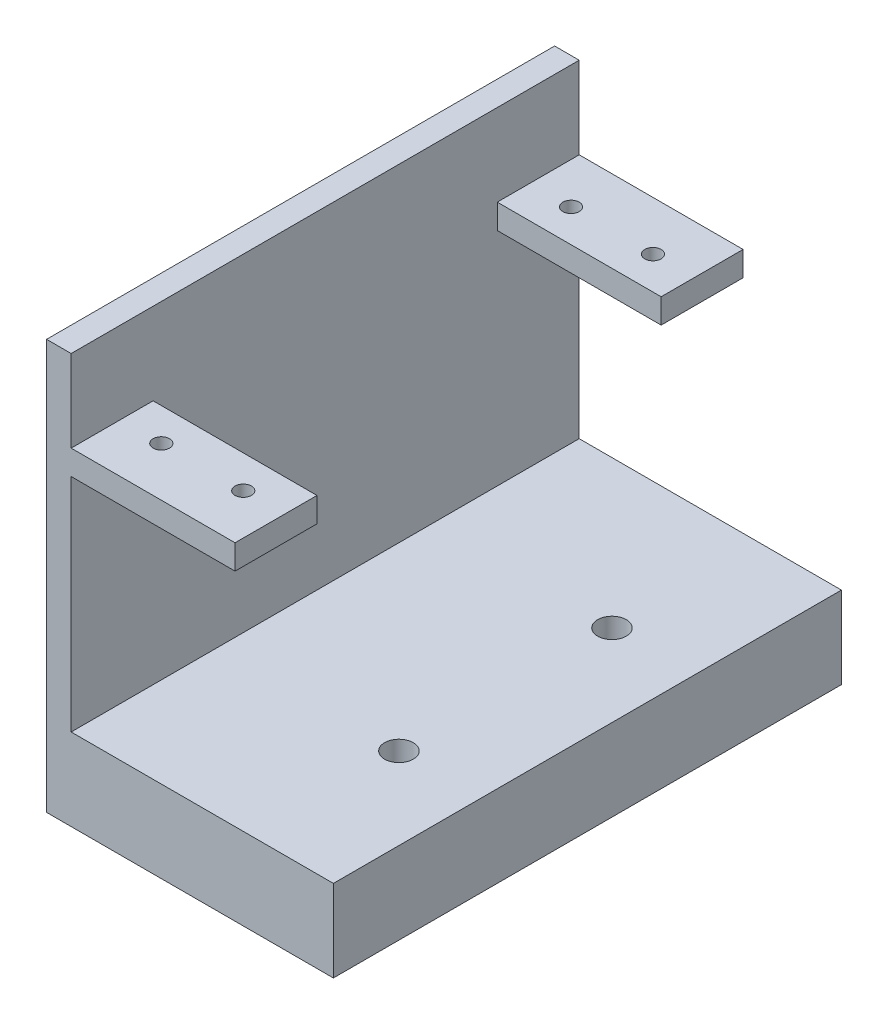
ISO-10303-21;
HEADER;
FILE_DESCRIPTION(('STEP AP214'),'2;1');
FILE_NAME('part.step','',(''),(''),'','','');
FILE_SCHEMA(('AUTOMOTIVE_DESIGN { 1 0 10303 214 1 1 1 1 }'));
ENDSEC;
DATA;
#1=APPLICATION_CONTEXT('core data for automotive mechanical design processes');
#2=APPLICATION_PROTOCOL_DEFINITION('international standard','automotive_design',2000,#1);
#3=PRODUCT_CONTEXT('',#1,'mechanical');
#4=PRODUCT('Part','Part','',(#3));
#5=PRODUCT_RELATED_PRODUCT_CATEGORY('part','',(#4));
#6=PRODUCT_DEFINITION_FORMATION('','',#4);
#7=PRODUCT_DEFINITION_CONTEXT('part definition',#1,'design');
#8=PRODUCT_DEFINITION('design','',#6,#7);
#9=PRODUCT_DEFINITION_SHAPE('','',#8);
#10=(LENGTH_UNIT() NAMED_UNIT(*) SI_UNIT(.MILLI.,.METRE.));
#11=(NAMED_UNIT(*) PLANE_ANGLE_UNIT() SI_UNIT($,.RADIAN.));
#12=(NAMED_UNIT(*) SI_UNIT($,.STERADIAN.) SOLID_ANGLE_UNIT());
#13=UNCERTAINTY_MEASURE_WITH_UNIT(LENGTH_MEASURE(1.E-05),#10,'distance_accuracy_value','');
#14=(GEOMETRIC_REPRESENTATION_CONTEXT(3) GLOBAL_UNCERTAINTY_ASSIGNED_CONTEXT((#13)) GLOBAL_UNIT_ASSIGNED_CONTEXT((#10,
#11,#12)) REPRESENTATION_CONTEXT('',''));
#15=CARTESIAN_POINT('',(0.,0.,0.));
#16=DIRECTION('',(0.,0.,1.));
#17=DIRECTION('',(1.,0.,0.));
#18=AXIS2_PLACEMENT_3D('',#15,#16,#17);
#19=CARTESIAN_POINT('',(23.,37.,0.));
#20=DIRECTION('',(0.,1.,0.));
#21=DIRECTION('',(-1.,0.,0.));
#22=AXIS2_PLACEMENT_3D('',#19,#20,#21);
#23=PLANE('',#22);
#24=CARTESIAN_POINT('',(18.,37.,6.00000058958081));
#25=DIRECTION('',(0.,-1.,0.));
#26=DIRECTION('',(0.,0.,-1.));
#27=AXIS2_PLACEMENT_3D('',#24,#25,#26);
#28=CIRCLE('',#27,0.999999999999987);
#29=CARTESIAN_POINT('',(18.,37.,5.00000058958082));
#30=VERTEX_POINT('',#29);
#31=EDGE_CURVE('E291',#30,#30,#28,.T.);
#32=ORIENTED_EDGE('',*,*,#31,.F.);
#33=EDGE_LOOP('',(#32));
#34=FACE_BOUND('',#33,.T.);
#35=DIRECTION('',(0.,0.,-1.));
#36=VECTOR('',#35,1.);
#37=CARTESIAN_POINT('',(3.00000000000004,37.,0.));
#38=LINE('',#37,#36);
#39=CARTESIAN_POINT('',(3.00000000000004,37.,10.));
#40=VERTEX_POINT('',#39);
#41=CARTESIAN_POINT('',(3.00000000000004,37.,0.));
#42=VERTEX_POINT('',#41);
#43=EDGE_CURVE('E160',#40,#42,#38,.T.);
#44=ORIENTED_EDGE('',*,*,#43,.T.);
#45=DIRECTION('',(-1.,0.,0.));
#46=VECTOR('',#45,1.);
#47=CARTESIAN_POINT('',(23.,37.,0.));
#48=LINE('',#47,#46);
#49=CARTESIAN_POINT('',(23.,37.,0.));
#50=VERTEX_POINT('',#49);
#51=EDGE_CURVE('E189',#50,#42,#48,.T.);
#52=ORIENTED_EDGE('',*,*,#51,.F.);
#53=DIRECTION('',(0.,0.,-1.));
#54=VECTOR('',#53,1.);
#55=CARTESIAN_POINT('',(23.,37.,0.));
#56=LINE('',#55,#54);
#57=CARTESIAN_POINT('',(23.,37.,10.));
#58=VERTEX_POINT('',#57);
#59=EDGE_CURVE('E169',#58,#50,#56,.T.);
#60=ORIENTED_EDGE('',*,*,#59,.F.);
#61=DIRECTION('',(-1.,0.,0.));
#62=VECTOR('',#61,1.);
#63=CARTESIAN_POINT('',(23.,37.,10.));
#64=LINE('',#63,#62);
#65=EDGE_CURVE('E177',#58,#40,#64,.T.);
#66=ORIENTED_EDGE('',*,*,#65,.T.);
#67=EDGE_LOOP('',(#44,#52,#60,#66));
#68=FACE_BOUND('',#67,.T.);
#69=CARTESIAN_POINT('',(8.,37.,6.00000058958085));
#70=DIRECTION('',(0.,-1.,0.));
#71=DIRECTION('',(0.,0.,-1.));
#72=AXIS2_PLACEMENT_3D('',#69,#70,#71);
#73=CIRCLE('',#72,0.999999999999987);
#74=CARTESIAN_POINT('',(8.,37.,5.00000058958086));
#75=VERTEX_POINT('',#74);
#76=EDGE_CURVE('E294',#75,#75,#73,.T.);
#77=ORIENTED_EDGE('',*,*,#76,.F.);
#78=EDGE_LOOP('',(#77));
#79=FACE_BOUND('',#78,.T.);
#80=ADVANCED_FACE('F37',(#34,#68,#79),#23,.F.);
#81=CARTESIAN_POINT('',(3.,10.,62.));
#82=DIRECTION('',(-1.,0.,0.));
#83=DIRECTION('',(0.,-1.,0.));
#84=AXIS2_PLACEMENT_3D('',#81,#82,#83);
#85=PLANE('',#84);
#86=DIRECTION('',(0.,0.,1.));
#87=VECTOR('',#86,1.);
#88=CARTESIAN_POINT('',(3.00000000000005,40.,62.));
#89=LINE('',#88,#87);
#90=CARTESIAN_POINT('',(3.00000000000005,40.,52.));
#91=VERTEX_POINT('',#90);
#92=CARTESIAN_POINT('',(3.00000000000005,40.,62.));
#93=VERTEX_POINT('',#92);
#94=EDGE_CURVE('E54',#91,#93,#89,.T.);
#95=ORIENTED_EDGE('',*,*,#94,.F.);
#96=DIRECTION('',(0.,1.,0.));
#97=VECTOR('',#96,1.);
#98=CARTESIAN_POINT('',(3.00000000000005,40.,52.));
#99=LINE('',#98,#97);
#100=CARTESIAN_POINT('',(3.00000000000004,37.,52.));
#101=VERTEX_POINT('',#100);
#102=EDGE_CURVE('E157',#101,#91,#99,.T.);
#103=ORIENTED_EDGE('',*,*,#102,.F.);
#104=DIRECTION('',(0.,0.,-1.));
#105=VECTOR('',#104,1.);
#106=CARTESIAN_POINT('',(3.00000000000004,37.,52.));
#107=LINE('',#106,#105);
#108=CARTESIAN_POINT('',(3.00000000000004,37.,62.));
#109=VERTEX_POINT('',#108);
#110=EDGE_CURVE('E261',#109,#101,#107,.T.);
#111=ORIENTED_EDGE('',*,*,#110,.F.);
#112=DIRECTION('',(0.,1.,0.));
#113=VECTOR('',#112,1.);
#114=CARTESIAN_POINT('',(3.,10.,62.));
#115=LINE('',#114,#113);
#116=CARTESIAN_POINT('',(3.,10.,62.));
#117=VERTEX_POINT('',#116);
#118=EDGE_CURVE('E198',#117,#109,#115,.T.);
#119=ORIENTED_EDGE('',*,*,#118,.F.);
#120=DIRECTION('',(0.,0.,-1.));
#121=VECTOR('',#120,1.);
#122=CARTESIAN_POINT('',(3.,10.,62.));
#123=LINE('',#122,#121);
#124=CARTESIAN_POINT('',(3.,10.,0.));
#125=VERTEX_POINT('',#124);
#126=EDGE_CURVE('E209',#117,#125,#123,.T.);
#127=ORIENTED_EDGE('',*,*,#126,.T.);
#128=DIRECTION('',(0.,1.,0.));
#129=VECTOR('',#128,1.);
#130=CARTESIAN_POINT('',(3.,10.,0.));
#131=LINE('',#130,#129);
#132=EDGE_CURVE('E197',#125,#42,#131,.T.);
#133=ORIENTED_EDGE('',*,*,#132,.T.);
#134=ORIENTED_EDGE('',*,*,#43,.F.);
#135=DIRECTION('',(0.,-1.,0.));
#136=VECTOR('',#135,1.);
#137=CARTESIAN_POINT('',(3.00000000000004,37.,10.));
#138=LINE('',#137,#136);
#139=CARTESIAN_POINT('',(3.00000000000005,40.,10.));
#140=VERTEX_POINT('',#139);
#141=EDGE_CURVE('E62',#140,#40,#138,.T.);
#142=ORIENTED_EDGE('',*,*,#141,.F.);
#143=DIRECTION('',(0.,0.,1.));
#144=VECTOR('',#143,1.);
#145=CARTESIAN_POINT('',(3.00000000000005,40.,10.));
#146=LINE('',#145,#144);
#147=CARTESIAN_POINT('',(3.00000000000005,40.,0.));
#148=VERTEX_POINT('',#147);
#149=EDGE_CURVE('E163',#148,#140,#146,.T.);
#150=ORIENTED_EDGE('',*,*,#149,.F.);
#151=CARTESIAN_POINT('',(3.00000000000006,50.,0.));
#152=VERTEX_POINT('',#151);
#153=EDGE_CURVE('E203',#148,#152,#131,.T.);
#154=ORIENTED_EDGE('',*,*,#153,.T.);
#155=DIRECTION('',(0.,0.,-1.));
#156=VECTOR('',#155,1.);
#157=CARTESIAN_POINT('',(3.00000000000006,50.,62.));
#158=LINE('',#157,#156);
#159=CARTESIAN_POINT('',(3.00000000000006,50.,62.));
#160=VERTEX_POINT('',#159);
#161=EDGE_CURVE('E205',#160,#152,#158,.T.);
#162=ORIENTED_EDGE('',*,*,#161,.F.);
#163=EDGE_CURVE('E196',#93,#160,#115,.T.);
#164=ORIENTED_EDGE('',*,*,#163,.F.);
#165=EDGE_LOOP('',(#95,#103,#111,#119,#127,#133,#134,#142,#150,#154,#162,#164));
#166=FACE_BOUND('',#165,.T.);
#167=ADVANCED_FACE('F259',(#166),#85,.F.);
#168=CARTESIAN_POINT('',(35.,0.,0.));
#169=DIRECTION('',(0.,-1.,0.));
#170=DIRECTION('',(1.,0.,0.));
#171=AXIS2_PLACEMENT_3D('',#168,#169,#170);
#172=PLANE('',#171);
#173=CARTESIAN_POINT('',(24.9999995646683,0.,18.));
#174=DIRECTION('',(0.,1.,0.));
#175=DIRECTION('',(0.,0.,1.));
#176=AXIS2_PLACEMENT_3D('',#173,#174,#175);
#177=CIRCLE('',#176,1.74999999999999);
#178=CARTESIAN_POINT('',(24.9999995646683,0.,19.75));
#179=VERTEX_POINT('',#178);
#180=EDGE_CURVE('E303',#179,#179,#177,.T.);
#181=ORIENTED_EDGE('',*,*,#180,.T.);
#182=EDGE_LOOP('',(#181));
#183=FACE_BOUND('',#182,.T.);
#184=CARTESIAN_POINT('',(24.9999995646683,0.,44.));
#185=DIRECTION('',(0.,1.,0.));
#186=DIRECTION('',(0.,0.,1.));
#187=AXIS2_PLACEMENT_3D('',#184,#185,#186);
#188=CIRCLE('',#187,1.74999999999999);
#189=CARTESIAN_POINT('',(24.9999995646683,0.,45.75));
#190=VERTEX_POINT('',#189);
#191=EDGE_CURVE('E297',#190,#190,#188,.T.);
#192=ORIENTED_EDGE('',*,*,#191,.T.);
#193=EDGE_LOOP('',(#192));
#194=FACE_BOUND('',#193,.T.);
#195=DIRECTION('',(0.,0.,1.));
#196=VECTOR('',#195,1.);
#197=CARTESIAN_POINT('',(0.,0.,0.));
#198=LINE('',#197,#196);
#199=CARTESIAN_POINT('',(0.,0.,0.));
#200=VERTEX_POINT('',#199);
#201=CARTESIAN_POINT('',(0.,0.,62.));
#202=VERTEX_POINT('',#201);
#203=EDGE_CURVE('E208',#200,#202,#198,.T.);
#204=ORIENTED_EDGE('',*,*,#203,.F.);
#205=DIRECTION('',(-1.,0.,0.));
#206=VECTOR('',#205,1.);
#207=CARTESIAN_POINT('',(35.,0.,0.));
#208=LINE('',#207,#206);
#209=CARTESIAN_POINT('',(35.,0.,0.));
#210=VERTEX_POINT('',#209);
#211=EDGE_CURVE('E11',#210,#200,#208,.T.);
#212=ORIENTED_EDGE('',*,*,#211,.F.);
#213=DIRECTION('',(0.,0.,1.));
#214=VECTOR('',#213,1.);
#215=CARTESIAN_POINT('',(35.,0.,0.));
#216=LINE('',#215,#214);
#217=CARTESIAN_POINT('',(35.,0.,62.));
#218=VERTEX_POINT('',#217);
#219=EDGE_CURVE('E212',#210,#218,#216,.T.);
#220=ORIENTED_EDGE('',*,*,#219,.T.);
#221=DIRECTION('',(-1.,0.,0.));
#222=VECTOR('',#221,1.);
#223=CARTESIAN_POINT('',(35.,0.,62.));
#224=LINE('',#223,#222);
#225=EDGE_CURVE('E221',#218,#202,#224,.T.);
#226=ORIENTED_EDGE('',*,*,#225,.T.);
#227=EDGE_LOOP('',(#204,#212,#220,#226));
#228=FACE_BOUND('',#227,.T.);
#229=ADVANCED_FACE('F39',(#183,#194,#228),#172,.T.);
#230=CARTESIAN_POINT('',(35.,50.,0.));
#231=DIRECTION('',(0.,0.,-1.));
#232=DIRECTION('',(-1.,0.,0.));
#233=AXIS2_PLACEMENT_3D('',#230,#231,#232);
#234=PLANE('',#233);
#235=ORIENTED_EDGE('',*,*,#132,.F.);
#236=DIRECTION('',(-1.,0.,0.));
#237=VECTOR('',#236,1.);
#238=CARTESIAN_POINT('',(35.,10.,0.));
#239=LINE('',#238,#237);
#240=CARTESIAN_POINT('',(35.,10.,0.));
#241=VERTEX_POINT('',#240);
#242=EDGE_CURVE('E192',#241,#125,#239,.T.);
#243=ORIENTED_EDGE('',*,*,#242,.F.);
#244=DIRECTION('',(0.,-1.,0.));
#245=VECTOR('',#244,1.);
#246=CARTESIAN_POINT('',(35.,50.,0.));
#247=LINE('',#246,#245);
#248=EDGE_CURVE('E219',#241,#210,#247,.T.);
#249=ORIENTED_EDGE('',*,*,#248,.T.);
#250=ORIENTED_EDGE('',*,*,#211,.T.);
#251=DIRECTION('',(0.,-1.,0.));
#252=VECTOR('',#251,1.);
#253=CARTESIAN_POINT('',(0.,50.,0.));
#254=LINE('',#253,#252);
#255=CARTESIAN_POINT('',(0.,50.,0.));
#256=VERTEX_POINT('',#255);
#257=EDGE_CURVE('E216',#256,#200,#254,.T.);
#258=ORIENTED_EDGE('',*,*,#257,.F.);
#259=DIRECTION('',(-1.,0.,0.));
#260=VECTOR('',#259,1.);
#261=CARTESIAN_POINT('',(35.,50.,0.));
#262=LINE('',#261,#260);
#263=EDGE_CURVE('E46',#152,#256,#262,.T.);
#264=ORIENTED_EDGE('',*,*,#263,.F.);
#265=ORIENTED_EDGE('',*,*,#153,.F.);
#266=DIRECTION('',(-1.,0.,0.));
#267=VECTOR('',#266,1.);
#268=CARTESIAN_POINT('',(23.,40.,0.));
#269=LINE('',#268,#267);
#270=CARTESIAN_POINT('',(23.,40.,0.));
#271=VERTEX_POINT('',#270);
#272=EDGE_CURVE('E186',#271,#148,#269,.T.);
#273=ORIENTED_EDGE('',*,*,#272,.F.);
#274=DIRECTION('',(0.,1.,0.));
#275=VECTOR('',#274,1.);
#276=CARTESIAN_POINT('',(23.,40.,0.));
#277=LINE('',#276,#275);
#278=EDGE_CURVE('E172',#50,#271,#277,.T.);
#279=ORIENTED_EDGE('',*,*,#278,.F.);
#280=ORIENTED_EDGE('',*,*,#51,.T.);
#281=EDGE_LOOP('',(#235,#243,#249,#250,#258,#264,#265,#273,#279,#280));
#282=FACE_BOUND('',#281,.T.);
#283=ADVANCED_FACE('F248',(#282),#234,.T.);
#284=CARTESIAN_POINT('',(35.,50.,62.));
#285=DIRECTION('',(0.,1.,0.));
#286=DIRECTION('',(-1.,0.,0.));
#287=AXIS2_PLACEMENT_3D('',#284,#285,#286);
#288=PLANE('',#287);
#289=ORIENTED_EDGE('',*,*,#161,.T.);
#290=ORIENTED_EDGE('',*,*,#263,.T.);
#291=DIRECTION('',(0.,0.,-1.));
#292=VECTOR('',#291,1.);
#293=CARTESIAN_POINT('',(0.,50.,62.));
#294=LINE('',#293,#292);
#295=CARTESIAN_POINT('',(0.,50.,62.));
#296=VERTEX_POINT('',#295);
#297=EDGE_CURVE('E227',#296,#256,#294,.T.);
#298=ORIENTED_EDGE('',*,*,#297,.F.);
#299=DIRECTION('',(-1.,0.,0.));
#300=VECTOR('',#299,1.);
#301=CARTESIAN_POINT('',(35.,50.,62.));
#302=LINE('',#301,#300);
#303=EDGE_CURVE('E233',#160,#296,#302,.T.);
#304=ORIENTED_EDGE('',*,*,#303,.F.);
#305=EDGE_LOOP('',(#289,#290,#298,#304));
#306=FACE_BOUND('',#305,.T.);
#307=ADVANCED_FACE('F351',(#306),#288,.T.);
#308=CARTESIAN_POINT('',(35.,0.,62.));
#309=DIRECTION('',(0.,0.,1.));
#310=DIRECTION('',(1.,0.,0.));
#311=AXIS2_PLACEMENT_3D('',#308,#309,#310);
#312=PLANE('',#311);
#313=ORIENTED_EDGE('',*,*,#118,.T.);
#314=DIRECTION('',(-1.,0.,0.));
#315=VECTOR('',#314,1.);
#316=CARTESIAN_POINT('',(23.,37.,62.));
#317=LINE('',#316,#315);
#318=CARTESIAN_POINT('',(23.,37.,62.));
#319=VERTEX_POINT('',#318);
#320=EDGE_CURVE('E146',#319,#109,#317,.T.);
#321=ORIENTED_EDGE('',*,*,#320,.F.);
#322=DIRECTION('',(0.,-1.,0.));
#323=VECTOR('',#322,1.);
#324=CARTESIAN_POINT('',(23.,37.,62.));
#325=LINE('',#324,#323);
#326=CARTESIAN_POINT('',(23.,40.,62.));
#327=VERTEX_POINT('',#326);
#328=EDGE_CURVE('E140',#327,#319,#325,.T.);
#329=ORIENTED_EDGE('',*,*,#328,.F.);
#330=DIRECTION('',(-1.,0.,0.));
#331=VECTOR('',#330,1.);
#332=CARTESIAN_POINT('',(23.,40.,62.));
#333=LINE('',#332,#331);
#334=EDGE_CURVE('E144',#327,#93,#333,.T.);
#335=ORIENTED_EDGE('',*,*,#334,.T.);
#336=ORIENTED_EDGE('',*,*,#163,.T.);
#337=ORIENTED_EDGE('',*,*,#303,.T.);
#338=DIRECTION('',(0.,1.,0.));
#339=VECTOR('',#338,1.);
#340=CARTESIAN_POINT('',(0.,0.,62.));
#341=LINE('',#340,#339);
#342=EDGE_CURVE('E224',#202,#296,#341,.T.);
#343=ORIENTED_EDGE('',*,*,#342,.F.);
#344=ORIENTED_EDGE('',*,*,#225,.F.);
#345=DIRECTION('',(0.,1.,0.));
#346=VECTOR('',#345,1.);
#347=CARTESIAN_POINT('',(35.,0.,62.));
#348=LINE('',#347,#346);
#349=CARTESIAN_POINT('',(35.,10.,62.));
#350=VERTEX_POINT('',#349);
#351=EDGE_CURVE('E215',#218,#350,#348,.T.);
#352=ORIENTED_EDGE('',*,*,#351,.T.);
#353=DIRECTION('',(-1.,0.,0.));
#354=VECTOR('',#353,1.);
#355=CARTESIAN_POINT('',(35.,10.,62.));
#356=LINE('',#355,#354);
#357=EDGE_CURVE('E193',#350,#117,#356,.T.);
#358=ORIENTED_EDGE('',*,*,#357,.T.);
#359=EDGE_LOOP('',(#313,#321,#329,#335,#336,#337,#343,#344,#352,#358));
#360=FACE_BOUND('',#359,.T.);
#361=ADVANCED_FACE('F143',(#360),#312,.T.);
#362=CARTESIAN_POINT('',(35.,0.,0.));
#363=DIRECTION('',(-1.,0.,0.));
#364=DIRECTION('',(0.,-1.,0.));
#365=AXIS2_PLACEMENT_3D('',#362,#363,#364);
#366=PLANE('',#365);
#367=ORIENTED_EDGE('',*,*,#248,.F.);
#368=DIRECTION('',(0.,0.,-1.));
#369=VECTOR('',#368,1.);
#370=CARTESIAN_POINT('',(35.,10.,62.));
#371=LINE('',#370,#369);
#372=EDGE_CURVE('E200',#350,#241,#371,.T.);
#373=ORIENTED_EDGE('',*,*,#372,.F.);
#374=ORIENTED_EDGE('',*,*,#351,.F.);
#375=ORIENTED_EDGE('',*,*,#219,.F.);
#376=EDGE_LOOP('',(#367,#373,#374,#375));
#377=FACE_BOUND('',#376,.T.);
#378=ADVANCED_FACE('F253',(#377),#366,.F.);
#379=CARTESIAN_POINT('',(0.,0.,0.));
#380=DIRECTION('',(-1.,0.,0.));
#381=DIRECTION('',(0.,-1.,0.));
#382=AXIS2_PLACEMENT_3D('',#379,#380,#381);
#383=PLANE('',#382);
#384=ORIENTED_EDGE('',*,*,#203,.T.);
#385=ORIENTED_EDGE('',*,*,#342,.T.);
#386=ORIENTED_EDGE('',*,*,#297,.T.);
#387=ORIENTED_EDGE('',*,*,#257,.T.);
#388=EDGE_LOOP('',(#384,#385,#386,#387));
#389=FACE_BOUND('',#388,.T.);
#390=ADVANCED_FACE('F243',(#389),#383,.T.);
#391=CARTESIAN_POINT('',(35.,10.,62.));
#392=DIRECTION('',(0.,-1.,0.));
#393=DIRECTION('',(0.,0.,-1.));
#394=AXIS2_PLACEMENT_3D('',#391,#392,#393);
#395=PLANE('',#394);
#396=CARTESIAN_POINT('',(24.9999995646683,10.,18.));
#397=DIRECTION('',(0.,1.,0.));
#398=DIRECTION('',(0.,0.,1.));
#399=AXIS2_PLACEMENT_3D('',#396,#397,#398);
#400=CIRCLE('',#399,1.74999999999999);
#401=CARTESIAN_POINT('',(24.9999995646683,10.,19.75));
#402=VERTEX_POINT('',#401);
#403=EDGE_CURVE('E306',#402,#402,#400,.T.);
#404=ORIENTED_EDGE('',*,*,#403,.F.);
#405=EDGE_LOOP('',(#404));
#406=FACE_BOUND('',#405,.T.);
#407=CARTESIAN_POINT('',(24.9999995646683,10.,44.));
#408=DIRECTION('',(0.,1.,0.));
#409=DIRECTION('',(0.,0.,1.));
#410=AXIS2_PLACEMENT_3D('',#407,#408,#409);
#411=CIRCLE('',#410,1.74999999999999);
#412=CARTESIAN_POINT('',(24.9999995646683,10.,45.75));
#413=VERTEX_POINT('',#412);
#414=EDGE_CURVE('E300',#413,#413,#411,.T.);
#415=ORIENTED_EDGE('',*,*,#414,.F.);
#416=EDGE_LOOP('',(#415));
#417=FACE_BOUND('',#416,.T.);
#418=ORIENTED_EDGE('',*,*,#242,.T.);
#419=ORIENTED_EDGE('',*,*,#126,.F.);
#420=ORIENTED_EDGE('',*,*,#357,.F.);
#421=ORIENTED_EDGE('',*,*,#372,.T.);
#422=EDGE_LOOP('',(#418,#419,#420,#421));
#423=FACE_BOUND('',#422,.T.);
#424=ADVANCED_FACE('F257',(#406,#417,#423),#395,.F.);
#425=CARTESIAN_POINT('',(23.,40.,10.));
#426=DIRECTION('',(0.,-1.,0.));
#427=DIRECTION('',(1.,0.,0.));
#428=AXIS2_PLACEMENT_3D('',#425,#426,#427);
#429=PLANE('',#428);
#430=CARTESIAN_POINT('',(8.,40.,6.00000058958085));
#431=DIRECTION('',(0.,-1.,0.));
#432=DIRECTION('',(1.,0.,0.));
#433=AXIS2_PLACEMENT_3D('',#430,#431,#432);
#434=CIRCLE('',#433,0.999999999999986);
#435=CARTESIAN_POINT('',(8.99999999999999,40.,6.00000058958085));
#436=VERTEX_POINT('',#435);
#437=EDGE_CURVE('E41',#436,#436,#434,.T.);
#438=ORIENTED_EDGE('',*,*,#437,.T.);
#439=EDGE_LOOP('',(#438));
#440=FACE_BOUND('',#439,.T.);
#441=CARTESIAN_POINT('',(18.,40.,6.00000058958081));
#442=DIRECTION('',(0.,-1.,0.));
#443=DIRECTION('',(1.,0.,0.));
#444=AXIS2_PLACEMENT_3D('',#441,#442,#443);
#445=CIRCLE('',#444,0.999999999999987);
#446=CARTESIAN_POINT('',(19.,40.,6.00000058958081));
#447=VERTEX_POINT('',#446);
#448=EDGE_CURVE('E288',#447,#447,#445,.T.);
#449=ORIENTED_EDGE('',*,*,#448,.T.);
#450=EDGE_LOOP('',(#449));
#451=FACE_BOUND('',#450,.T.);
#452=ORIENTED_EDGE('',*,*,#149,.T.);
#453=DIRECTION('',(-1.,0.,0.));
#454=VECTOR('',#453,1.);
#455=CARTESIAN_POINT('',(23.,40.,10.));
#456=LINE('',#455,#454);
#457=CARTESIAN_POINT('',(23.,40.,10.));
#458=VERTEX_POINT('',#457);
#459=EDGE_CURVE('E183',#458,#140,#456,.T.);
#460=ORIENTED_EDGE('',*,*,#459,.F.);
#461=DIRECTION('',(0.,0.,1.));
#462=VECTOR('',#461,1.);
#463=CARTESIAN_POINT('',(23.,40.,10.));
#464=LINE('',#463,#462);
#465=EDGE_CURVE('E174',#271,#458,#464,.T.);
#466=ORIENTED_EDGE('',*,*,#465,.F.);
#467=ORIENTED_EDGE('',*,*,#272,.T.);
#468=EDGE_LOOP('',(#452,#460,#466,#467));
#469=FACE_BOUND('',#468,.T.);
#470=ADVANCED_FACE('F314',(#440,#451,#469),#429,.F.);
#471=CARTESIAN_POINT('',(23.,37.,10.));
#472=DIRECTION('',(0.,0.,-1.));
#473=DIRECTION('',(-1.,0.,0.));
#474=AXIS2_PLACEMENT_3D('',#471,#472,#473);
#475=PLANE('',#474);
#476=ORIENTED_EDGE('',*,*,#141,.T.);
#477=ORIENTED_EDGE('',*,*,#65,.F.);
#478=DIRECTION('',(0.,-1.,0.));
#479=VECTOR('',#478,1.);
#480=CARTESIAN_POINT('',(23.,37.,10.));
#481=LINE('',#480,#479);
#482=EDGE_CURVE('E176',#458,#58,#481,.T.);
#483=ORIENTED_EDGE('',*,*,#482,.F.);
#484=ORIENTED_EDGE('',*,*,#459,.T.);
#485=EDGE_LOOP('',(#476,#477,#483,#484));
#486=FACE_BOUND('',#485,.T.);
#487=ADVANCED_FACE('F381',(#486),#475,.F.);
#488=CARTESIAN_POINT('',(22.9999999999999,0.,0.));
#489=DIRECTION('',(-1.,0.,0.));
#490=DIRECTION('',(0.,-1.,0.));
#491=AXIS2_PLACEMENT_3D('',#488,#489,#490);
#492=PLANE('',#491);
#493=ORIENTED_EDGE('',*,*,#59,.T.);
#494=ORIENTED_EDGE('',*,*,#278,.T.);
#495=ORIENTED_EDGE('',*,*,#465,.T.);
#496=ORIENTED_EDGE('',*,*,#482,.T.);
#497=EDGE_LOOP('',(#493,#494,#495,#496));
#498=FACE_BOUND('',#497,.T.);
#499=ADVANCED_FACE('F389',(#498),#492,.F.);
#500=CARTESIAN_POINT('',(23.,40.,62.));
#501=DIRECTION('',(0.,-1.,0.));
#502=DIRECTION('',(1.,0.,0.));
#503=AXIS2_PLACEMENT_3D('',#500,#501,#502);
#504=PLANE('',#503);
#505=CARTESIAN_POINT('',(8.,40.,55.9999994104192));
#506=DIRECTION('',(0.,-1.,0.));
#507=DIRECTION('',(1.,0.,0.));
#508=AXIS2_PLACEMENT_3D('',#505,#506,#507);
#509=CIRCLE('',#508,0.999999999999986);
#510=CARTESIAN_POINT('',(8.99999999999999,40.,55.9999994104192));
#511=VERTEX_POINT('',#510);
#512=EDGE_CURVE('E282',#511,#511,#509,.T.);
#513=ORIENTED_EDGE('',*,*,#512,.T.);
#514=EDGE_LOOP('',(#513));
#515=FACE_BOUND('',#514,.T.);
#516=CARTESIAN_POINT('',(18.,40.,55.9999994104192));
#517=DIRECTION('',(0.,-1.,0.));
#518=DIRECTION('',(1.,0.,0.));
#519=AXIS2_PLACEMENT_3D('',#516,#517,#518);
#520=CIRCLE('',#519,0.999999999999987);
#521=CARTESIAN_POINT('',(19.,40.,55.9999994104192));
#522=VERTEX_POINT('',#521);
#523=EDGE_CURVE('E267',#522,#522,#520,.T.);
#524=ORIENTED_EDGE('',*,*,#523,.T.);
#525=EDGE_LOOP('',(#524));
#526=FACE_BOUND('',#525,.T.);
#527=ORIENTED_EDGE('',*,*,#94,.T.);
#528=ORIENTED_EDGE('',*,*,#334,.F.);
#529=DIRECTION('',(0.,0.,1.));
#530=VECTOR('',#529,1.);
#531=CARTESIAN_POINT('',(23.,40.,62.));
#532=LINE('',#531,#530);
#533=CARTESIAN_POINT('',(23.,40.,52.));
#534=VERTEX_POINT('',#533);
#535=EDGE_CURVE('E150',#534,#327,#532,.T.);
#536=ORIENTED_EDGE('',*,*,#535,.F.);
#537=DIRECTION('',(-1.,0.,0.));
#538=VECTOR('',#537,1.);
#539=CARTESIAN_POINT('',(23.,40.,52.));
#540=LINE('',#539,#538);
#541=EDGE_CURVE('E271',#534,#91,#540,.T.);
#542=ORIENTED_EDGE('',*,*,#541,.T.);
#543=EDGE_LOOP('',(#527,#528,#536,#542));
#544=FACE_BOUND('',#543,.T.);
#545=ADVANCED_FACE('F159',(#515,#526,#544),#504,.F.);
#546=CARTESIAN_POINT('',(23.,37.,52.));
#547=DIRECTION('',(0.,1.,0.));
#548=DIRECTION('',(-1.,0.,0.));
#549=AXIS2_PLACEMENT_3D('',#546,#547,#548);
#550=PLANE('',#549);
#551=CARTESIAN_POINT('',(8.,37.,55.9999994104192));
#552=DIRECTION('',(0.,-1.,0.));
#553=DIRECTION('',(0.,0.,-1.));
#554=AXIS2_PLACEMENT_3D('',#551,#552,#553);
#555=CIRCLE('',#554,0.999999999999987);
#556=CARTESIAN_POINT('',(8.,37.,54.9999994104192));
#557=VERTEX_POINT('',#556);
#558=EDGE_CURVE('E285',#557,#557,#555,.T.);
#559=ORIENTED_EDGE('',*,*,#558,.F.);
#560=EDGE_LOOP('',(#559));
#561=FACE_BOUND('',#560,.T.);
#562=CARTESIAN_POINT('',(18.,37.,55.9999994104192));
#563=DIRECTION('',(0.,-1.,0.));
#564=DIRECTION('',(0.,0.,-1.));
#565=AXIS2_PLACEMENT_3D('',#562,#563,#564);
#566=CIRCLE('',#565,0.999999999999987);
#567=CARTESIAN_POINT('',(18.,37.,54.9999994104192));
#568=VERTEX_POINT('',#567);
#569=EDGE_CURVE('E279',#568,#568,#566,.T.);
#570=ORIENTED_EDGE('',*,*,#569,.F.);
#571=EDGE_LOOP('',(#570));
#572=FACE_BOUND('',#571,.T.);
#573=ORIENTED_EDGE('',*,*,#110,.T.);
#574=DIRECTION('',(-1.,0.,0.));
#575=VECTOR('',#574,1.);
#576=CARTESIAN_POINT('',(23.,37.,52.));
#577=LINE('',#576,#575);
#578=CARTESIAN_POINT('',(23.,37.,52.));
#579=VERTEX_POINT('',#578);
#580=EDGE_CURVE('E165',#579,#101,#577,.T.);
#581=ORIENTED_EDGE('',*,*,#580,.F.);
#582=DIRECTION('',(0.,0.,-1.));
#583=VECTOR('',#582,1.);
#584=CARTESIAN_POINT('',(23.,37.,52.));
#585=LINE('',#584,#583);
#586=EDGE_CURVE('E149',#319,#579,#585,.T.);
#587=ORIENTED_EDGE('',*,*,#586,.F.);
#588=ORIENTED_EDGE('',*,*,#320,.T.);
#589=EDGE_LOOP('',(#573,#581,#587,#588));
#590=FACE_BOUND('',#589,.T.);
#591=ADVANCED_FACE('F274',(#561,#572,#590),#550,.F.);
#592=CARTESIAN_POINT('',(23.,40.,52.));
#593=DIRECTION('',(0.,0.,1.));
#594=DIRECTION('',(1.,0.,0.));
#595=AXIS2_PLACEMENT_3D('',#592,#593,#594);
#596=PLANE('',#595);
#597=ORIENTED_EDGE('',*,*,#102,.T.);
#598=ORIENTED_EDGE('',*,*,#541,.F.);
#599=DIRECTION('',(0.,1.,0.));
#600=VECTOR('',#599,1.);
#601=CARTESIAN_POINT('',(23.,40.,52.));
#602=LINE('',#601,#600);
#603=EDGE_CURVE('E155',#579,#534,#602,.T.);
#604=ORIENTED_EDGE('',*,*,#603,.F.);
#605=ORIENTED_EDGE('',*,*,#580,.T.);
#606=EDGE_LOOP('',(#597,#598,#604,#605));
#607=FACE_BOUND('',#606,.T.);
#608=ADVANCED_FACE('F273',(#607),#596,.F.);
#609=CARTESIAN_POINT('',(23.,0.,0.));
#610=DIRECTION('',(-1.,0.,0.));
#611=DIRECTION('',(0.,-1.,0.));
#612=AXIS2_PLACEMENT_3D('',#609,#610,#611);
#613=PLANE('',#612);
#614=ORIENTED_EDGE('',*,*,#535,.T.);
#615=ORIENTED_EDGE('',*,*,#328,.T.);
#616=ORIENTED_EDGE('',*,*,#586,.T.);
#617=ORIENTED_EDGE('',*,*,#603,.T.);
#618=EDGE_LOOP('',(#614,#615,#616,#617));
#619=FACE_BOUND('',#618,.T.);
#620=ADVANCED_FACE('F153',(#619),#613,.F.);
#621=CARTESIAN_POINT('',(18.,37.,55.9999994104192));
#622=DIRECTION('',(0.,-1.,0.));
#623=DIRECTION('',(0.,0.,-1.));
#624=AXIS2_PLACEMENT_3D('',#621,#622,#623);
#625=CYLINDRICAL_SURFACE('',#624,0.999999999999987);
#626=ORIENTED_EDGE('',*,*,#569,.T.);
#627=EDGE_LOOP('',(#626));
#628=FACE_BOUND('',#627,.T.);
#629=ORIENTED_EDGE('',*,*,#523,.F.);
#630=EDGE_LOOP('',(#629));
#631=FACE_BOUND('',#630,.T.);
#632=ADVANCED_FACE('F422',(#628,#631),#625,.F.);
#633=CARTESIAN_POINT('',(8.,37.,55.9999994104192));
#634=DIRECTION('',(0.,-1.,0.));
#635=DIRECTION('',(0.,0.,-1.));
#636=AXIS2_PLACEMENT_3D('',#633,#634,#635);
#637=CYLINDRICAL_SURFACE('',#636,0.999999999999986);
#638=ORIENTED_EDGE('',*,*,#558,.T.);
#639=EDGE_LOOP('',(#638));
#640=FACE_BOUND('',#639,.T.);
#641=ORIENTED_EDGE('',*,*,#512,.F.);
#642=EDGE_LOOP('',(#641));
#643=FACE_BOUND('',#642,.T.);
#644=ADVANCED_FACE('F428',(#640,#643),#637,.F.);
#645=CARTESIAN_POINT('',(18.,37.,6.00000058958081));
#646=DIRECTION('',(0.,-1.,0.));
#647=DIRECTION('',(0.,0.,-1.));
#648=AXIS2_PLACEMENT_3D('',#645,#646,#647);
#649=CYLINDRICAL_SURFACE('',#648,0.999999999999987);
#650=ORIENTED_EDGE('',*,*,#31,.T.);
#651=EDGE_LOOP('',(#650));
#652=FACE_BOUND('',#651,.T.);
#653=ORIENTED_EDGE('',*,*,#448,.F.);
#654=EDGE_LOOP('',(#653));
#655=FACE_BOUND('',#654,.T.);
#656=ADVANCED_FACE('F329',(#652,#655),#649,.F.);
#657=CARTESIAN_POINT('',(8.,37.,6.00000058958085));
#658=DIRECTION('',(0.,-1.,0.));
#659=DIRECTION('',(0.,0.,-1.));
#660=AXIS2_PLACEMENT_3D('',#657,#658,#659);
#661=CYLINDRICAL_SURFACE('',#660,0.999999999999986);
#662=ORIENTED_EDGE('',*,*,#76,.T.);
#663=EDGE_LOOP('',(#662));
#664=FACE_BOUND('',#663,.T.);
#665=ORIENTED_EDGE('',*,*,#437,.F.);
#666=EDGE_LOOP('',(#665));
#667=FACE_BOUND('',#666,.T.);
#668=ADVANCED_FACE('F320',(#664,#667),#661,.F.);
#669=CARTESIAN_POINT('',(24.9999995646683,10.,44.));
#670=DIRECTION('',(0.,1.,0.));
#671=DIRECTION('',(0.,0.,1.));
#672=AXIS2_PLACEMENT_3D('',#669,#670,#671);
#673=CYLINDRICAL_SURFACE('',#672,1.74999999999999);
#674=ORIENTED_EDGE('',*,*,#191,.F.);
#675=EDGE_LOOP('',(#674));
#676=FACE_BOUND('',#675,.T.);
#677=ORIENTED_EDGE('',*,*,#414,.T.);
#678=EDGE_LOOP('',(#677));
#679=FACE_BOUND('',#678,.T.);
#680=ADVANCED_FACE('F318',(#676,#679),#673,.F.);
#681=CARTESIAN_POINT('',(24.9999995646683,10.,18.));
#682=DIRECTION('',(0.,1.,0.));
#683=DIRECTION('',(0.,0.,1.));
#684=AXIS2_PLACEMENT_3D('',#681,#682,#683);
#685=CYLINDRICAL_SURFACE('',#684,1.74999999999999);
#686=ORIENTED_EDGE('',*,*,#180,.F.);
#687=EDGE_LOOP('',(#686));
#688=FACE_BOUND('',#687,.T.);
#689=ORIENTED_EDGE('',*,*,#403,.T.);
#690=EDGE_LOOP('',(#689));
#691=FACE_BOUND('',#690,.T.);
#692=ADVANCED_FACE('F310',(#688,#691),#685,.F.);
#693=CLOSED_SHELL('',(#80,#167,#229,#283,#307,#361,#378,#390,#424,#470,#487,#499,#545,#591,#608,
#620,#632,#644,#656,#668,#680,#692));
#694=MANIFOLD_SOLID_BREP('B2',#693);
#695=ADVANCED_BREP_SHAPE_REPRESENTATION('',(#18,#694),#14);
#696=SHAPE_DEFINITION_REPRESENTATION(#9,#695);
ENDSEC;
END-ISO-10303-21;
